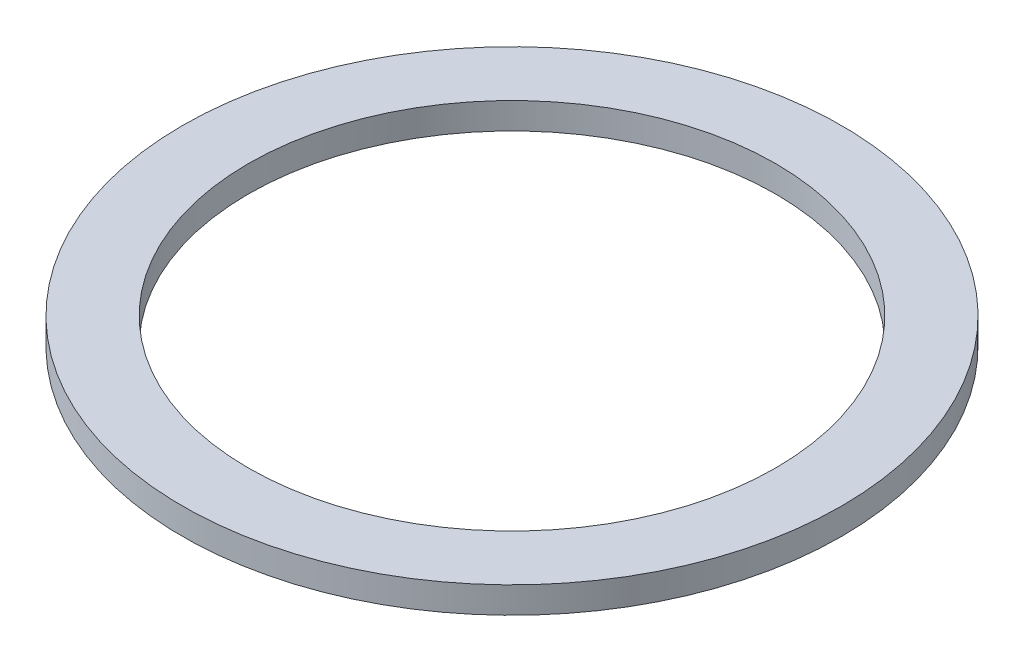
ISO-10303-21;
HEADER;
FILE_DESCRIPTION(('STEP AP214'),'2;1');
FILE_NAME('part.step','',(''),(''),'','','');
FILE_SCHEMA(('AUTOMOTIVE_DESIGN { 1 0 10303 214 1 1 1 1 }'));
ENDSEC;
DATA;
#1=APPLICATION_CONTEXT('core data for automotive mechanical design processes');
#2=APPLICATION_PROTOCOL_DEFINITION('international standard','automotive_design',2000,#1);
#3=PRODUCT_CONTEXT('',#1,'mechanical');
#4=PRODUCT('Part','Part','',(#3));
#5=PRODUCT_RELATED_PRODUCT_CATEGORY('part','',(#4));
#6=PRODUCT_DEFINITION_FORMATION('','',#4);
#7=PRODUCT_DEFINITION_CONTEXT('part definition',#1,'design');
#8=PRODUCT_DEFINITION('design','',#6,#7);
#9=PRODUCT_DEFINITION_SHAPE('','',#8);
#10=(LENGTH_UNIT() NAMED_UNIT(*) SI_UNIT(.MILLI.,.METRE.));
#11=(NAMED_UNIT(*) PLANE_ANGLE_UNIT() SI_UNIT($,.RADIAN.));
#12=(NAMED_UNIT(*) SI_UNIT($,.STERADIAN.) SOLID_ANGLE_UNIT());
#13=UNCERTAINTY_MEASURE_WITH_UNIT(LENGTH_MEASURE(1.E-05),#10,'distance_accuracy_value','');
#14=(GEOMETRIC_REPRESENTATION_CONTEXT(3) GLOBAL_UNCERTAINTY_ASSIGNED_CONTEXT((#13)) GLOBAL_UNIT_ASSIGNED_CONTEXT((#10,
#11,#12)) REPRESENTATION_CONTEXT('',''));
#15=CARTESIAN_POINT('',(0.,0.,0.));
#16=DIRECTION('',(0.,0.,1.));
#17=DIRECTION('',(1.,0.,0.));
#18=AXIS2_PLACEMENT_3D('',#15,#16,#17);
#19=CARTESIAN_POINT('',(2.54,0.,2.33));
#20=DIRECTION('',(0.,-1.,0.));
#21=DIRECTION('',(1.,0.,0.));
#22=AXIS2_PLACEMENT_3D('',#19,#20,#21);
#23=CYLINDRICAL_SURFACE('',#22,1.);
#24=CARTESIAN_POINT('',(2.54,0.,2.33));
#25=DIRECTION('',(0.,1.,0.));
#26=DIRECTION('',(1.,0.,0.));
#27=AXIS2_PLACEMENT_3D('',#24,#25,#26);
#28=CIRCLE('',#27,1.);
#29=CARTESIAN_POINT('',(3.54,0.,2.33));
#30=VERTEX_POINT('',#29);
#31=EDGE_CURVE('E10',#30,#30,#28,.T.);
#32=ORIENTED_EDGE('',*,*,#31,.T.);
#33=EDGE_LOOP('',(#32));
#34=FACE_BOUND('',#33,.T.);
#35=CARTESIAN_POINT('',(2.54,-0.1,2.33));
#36=DIRECTION('',(0.,1.,0.));
#37=DIRECTION('',(1.,0.,0.));
#38=AXIS2_PLACEMENT_3D('',#35,#36,#37);
#39=CIRCLE('',#38,1.);
#40=CARTESIAN_POINT('',(3.54,-0.1,2.33));
#41=VERTEX_POINT('',#40);
#42=EDGE_CURVE('E29',#41,#41,#39,.T.);
#43=ORIENTED_EDGE('',*,*,#42,.F.);
#44=EDGE_LOOP('',(#43));
#45=FACE_BOUND('',#44,.T.);
#46=ADVANCED_FACE('F15',(#34,#45),#23,.F.);
#47=CARTESIAN_POINT('',(2.54,0.,2.33));
#48=DIRECTION('',(0.,-1.,0.));
#49=DIRECTION('',(1.,0.,0.));
#50=AXIS2_PLACEMENT_3D('',#47,#48,#49);
#51=CYLINDRICAL_SURFACE('',#50,1.25);
#52=CARTESIAN_POINT('',(2.54,0.,2.33));
#53=DIRECTION('',(0.,-1.,0.));
#54=DIRECTION('',(1.,0.,0.));
#55=AXIS2_PLACEMENT_3D('',#52,#53,#54);
#56=CIRCLE('',#55,1.25);
#57=CARTESIAN_POINT('',(3.79,0.,2.33));
#58=VERTEX_POINT('',#57);
#59=EDGE_CURVE('E19',#58,#58,#56,.T.);
#60=ORIENTED_EDGE('',*,*,#59,.T.);
#61=EDGE_LOOP('',(#60));
#62=FACE_BOUND('',#61,.T.);
#63=CARTESIAN_POINT('',(2.54,-0.1,2.33));
#64=DIRECTION('',(0.,-1.,0.));
#65=DIRECTION('',(1.,0.,0.));
#66=AXIS2_PLACEMENT_3D('',#63,#64,#65);
#67=CIRCLE('',#66,1.25);
#68=CARTESIAN_POINT('',(3.79,-0.1,2.33));
#69=VERTEX_POINT('',#68);
#70=EDGE_CURVE('E27',#69,#69,#67,.T.);
#71=ORIENTED_EDGE('',*,*,#70,.F.);
#72=EDGE_LOOP('',(#71));
#73=FACE_BOUND('',#72,.T.);
#74=ADVANCED_FACE('F39',(#62,#73),#51,.T.);
#75=CARTESIAN_POINT('',(2.54,-0.1,2.33));
#76=DIRECTION('',(0.,-1.,0.));
#77=DIRECTION('',(1.,0.,0.));
#78=AXIS2_PLACEMENT_3D('',#75,#76,#77);
#79=PLANE('',#78);
#80=ORIENTED_EDGE('',*,*,#70,.T.);
#81=EDGE_LOOP('',(#80));
#82=FACE_BOUND('',#81,.T.);
#83=ORIENTED_EDGE('',*,*,#42,.T.);
#84=EDGE_LOOP('',(#83));
#85=FACE_BOUND('',#84,.T.);
#86=ADVANCED_FACE('F36',(#82,#85),#79,.T.);
#87=CARTESIAN_POINT('',(2.54,0.,2.33));
#88=DIRECTION('',(0.,-1.,0.));
#89=DIRECTION('',(1.,0.,0.));
#90=AXIS2_PLACEMENT_3D('',#87,#88,#89);
#91=PLANE('',#90);
#92=ORIENTED_EDGE('',*,*,#59,.F.);
#93=EDGE_LOOP('',(#92));
#94=FACE_BOUND('',#93,.T.);
#95=ORIENTED_EDGE('',*,*,#31,.F.);
#96=EDGE_LOOP('',(#95));
#97=FACE_BOUND('',#96,.T.);
#98=ADVANCED_FACE('F17',(#94,#97),#91,.F.);
#99=CLOSED_SHELL('',(#46,#74,#86,#98));
#100=MANIFOLD_SOLID_BREP('B1',#99);
#101=ADVANCED_BREP_SHAPE_REPRESENTATION('',(#18,#100),#14);
#102=SHAPE_DEFINITION_REPRESENTATION(#9,#101);
ENDSEC;
END-ISO-10303-21;
